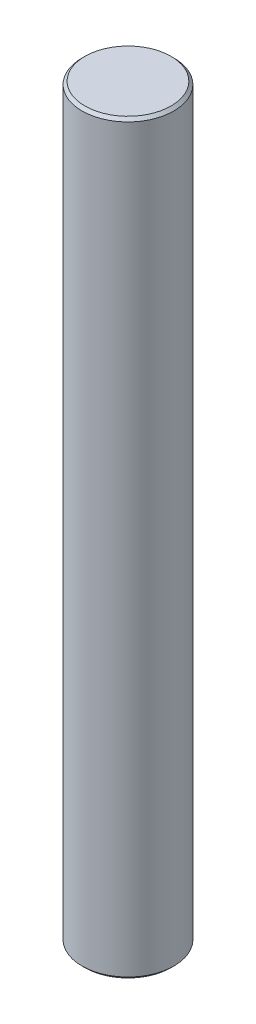
ISO-10303-21;
HEADER;
FILE_DESCRIPTION(('STEP AP214'),'2;1');
FILE_NAME('part.step','',(''),(''),'','','');
FILE_SCHEMA(('AUTOMOTIVE_DESIGN { 1 0 10303 214 1 1 1 1 }'));
ENDSEC;
DATA;
#1=APPLICATION_CONTEXT('core data for automotive mechanical design processes');
#2=APPLICATION_PROTOCOL_DEFINITION('international standard','automotive_design',2000,#1);
#3=PRODUCT_CONTEXT('',#1,'mechanical');
#4=PRODUCT('Part','Part','',(#3));
#5=PRODUCT_RELATED_PRODUCT_CATEGORY('part','',(#4));
#6=PRODUCT_DEFINITION_FORMATION('','',#4);
#7=PRODUCT_DEFINITION_CONTEXT('part definition',#1,'design');
#8=PRODUCT_DEFINITION('design','',#6,#7);
#9=PRODUCT_DEFINITION_SHAPE('','',#8);
#10=(LENGTH_UNIT() NAMED_UNIT(*) SI_UNIT(.MILLI.,.METRE.));
#11=(NAMED_UNIT(*) PLANE_ANGLE_UNIT() SI_UNIT($,.RADIAN.));
#12=(NAMED_UNIT(*) SI_UNIT($,.STERADIAN.) SOLID_ANGLE_UNIT());
#13=UNCERTAINTY_MEASURE_WITH_UNIT(LENGTH_MEASURE(1.E-05),#10,'distance_accuracy_value','');
#14=(GEOMETRIC_REPRESENTATION_CONTEXT(3) GLOBAL_UNCERTAINTY_ASSIGNED_CONTEXT((#13)) GLOBAL_UNIT_ASSIGNED_CONTEXT((#10,
#11,#12)) REPRESENTATION_CONTEXT('',''));
#15=CARTESIAN_POINT('',(0.,0.,0.));
#16=DIRECTION('',(0.,0.,1.));
#17=DIRECTION('',(1.,0.,0.));
#18=AXIS2_PLACEMENT_3D('',#15,#16,#17);
#19=CARTESIAN_POINT('',(0.,65.,0.));
#20=DIRECTION('',(0.,-1.,0.));
#21=DIRECTION('',(0.,0.,-1.));
#22=AXIS2_PLACEMENT_3D('',#19,#20,#21);
#23=CYLINDRICAL_SURFACE('',#22,4.);
#24=CARTESIAN_POINT('',(0.,0.250000000000014,0.));
#25=DIRECTION('',(0.,1.,0.));
#26=DIRECTION('',(0.,0.,1.));
#27=AXIS2_PLACEMENT_3D('',#24,#25,#26);
#28=CIRCLE('',#27,4.);
#29=CARTESIAN_POINT('',(0.,0.250000000000014,4.));
#30=VERTEX_POINT('',#29);
#31=EDGE_CURVE('E53',#30,#30,#28,.T.);
#32=ORIENTED_EDGE('',*,*,#31,.T.);
#33=EDGE_LOOP('',(#32));
#34=FACE_BOUND('',#33,.T.);
#35=CARTESIAN_POINT('',(0.,64.75,0.));
#36=DIRECTION('',(0.,1.,0.));
#37=DIRECTION('',(0.,0.,1.));
#38=AXIS2_PLACEMENT_3D('',#35,#36,#37);
#39=CIRCLE('',#38,4.);
#40=CARTESIAN_POINT('',(0.,64.75,4.));
#41=VERTEX_POINT('',#40);
#42=EDGE_CURVE('E58',#41,#41,#39,.F.);
#43=ORIENTED_EDGE('',*,*,#42,.T.);
#44=EDGE_LOOP('',(#43));
#45=FACE_BOUND('',#44,.T.);
#46=ADVANCED_FACE('F39',(#34,#45),#23,.T.);
#47=CARTESIAN_POINT('',(0.,65.,0.));
#48=DIRECTION('',(0.,1.,0.));
#49=DIRECTION('',(0.,0.,1.));
#50=AXIS2_PLACEMENT_3D('',#47,#48,#49);
#51=PLANE('',#50);
#52=CARTESIAN_POINT('',(0.,65.,0.));
#53=DIRECTION('',(0.,1.,0.));
#54=DIRECTION('',(0.,0.,1.));
#55=AXIS2_PLACEMENT_3D('',#52,#53,#54);
#56=CIRCLE('',#55,3.75);
#57=CARTESIAN_POINT('',(0.,65.,3.75));
#58=VERTEX_POINT('',#57);
#59=EDGE_CURVE('E10',#58,#58,#56,.T.);
#60=ORIENTED_EDGE('',*,*,#59,.T.);
#61=EDGE_LOOP('',(#60));
#62=FACE_BOUND('',#61,.T.);
#63=ADVANCED_FACE('F75',(#62),#51,.T.);
#64=CARTESIAN_POINT('',(0.,0.,0.));
#65=DIRECTION('',(0.,1.,0.));
#66=DIRECTION('',(0.,0.,1.));
#67=AXIS2_PLACEMENT_3D('',#64,#65,#66);
#68=PLANE('',#67);
#69=CARTESIAN_POINT('',(0.,0.,0.));
#70=DIRECTION('',(0.,1.,0.));
#71=DIRECTION('',(0.,0.,1.));
#72=AXIS2_PLACEMENT_3D('',#69,#70,#71);
#73=CIRCLE('',#72,3.74999999999999);
#74=CARTESIAN_POINT('',(0.,0.,3.74999999999999));
#75=VERTEX_POINT('',#74);
#76=EDGE_CURVE('E48',#75,#75,#73,.F.);
#77=ORIENTED_EDGE('',*,*,#76,.T.);
#78=EDGE_LOOP('',(#77));
#79=FACE_BOUND('',#78,.T.);
#80=ADVANCED_FACE('F72',(#79),#68,.F.);
#81=CARTESIAN_POINT('',(0.,0.250000000000014,0.));
#82=DIRECTION('',(0.,1.,0.));
#83=DIRECTION('',(0.,0.,1.));
#84=AXIS2_PLACEMENT_3D('',#81,#82,#83);
#85=CONICAL_SURFACE('',#84,4.,0.785398163397441);
#86=ORIENTED_EDGE('',*,*,#76,.F.);
#87=EDGE_LOOP('',(#86));
#88=FACE_BOUND('',#87,.T.);
#89=ORIENTED_EDGE('',*,*,#31,.F.);
#90=EDGE_LOOP('',(#89));
#91=FACE_BOUND('',#90,.T.);
#92=ADVANCED_FACE('F68',(#88,#91),#85,.T.);
#93=CARTESIAN_POINT('',(0.,65.,0.));
#94=DIRECTION('',(0.,-1.,0.));
#95=DIRECTION('',(0.,0.,-1.));
#96=AXIS2_PLACEMENT_3D('',#93,#94,#95);
#97=CONICAL_SURFACE('',#96,3.75,0.785398163397414);
#98=ORIENTED_EDGE('',*,*,#42,.F.);
#99=EDGE_LOOP('',(#98));
#100=FACE_BOUND('',#99,.T.);
#101=ORIENTED_EDGE('',*,*,#59,.F.);
#102=EDGE_LOOP('',(#101));
#103=FACE_BOUND('',#102,.T.);
#104=ADVANCED_FACE('F42',(#100,#103),#97,.T.);
#105=CLOSED_SHELL('',(#46,#63,#80,#92,#104));
#106=MANIFOLD_SOLID_BREP('B2',#105);
#107=ADVANCED_BREP_SHAPE_REPRESENTATION('',(#18,#106),#14);
#108=SHAPE_DEFINITION_REPRESENTATION(#9,#107);
ENDSEC;
END-ISO-10303-21;
